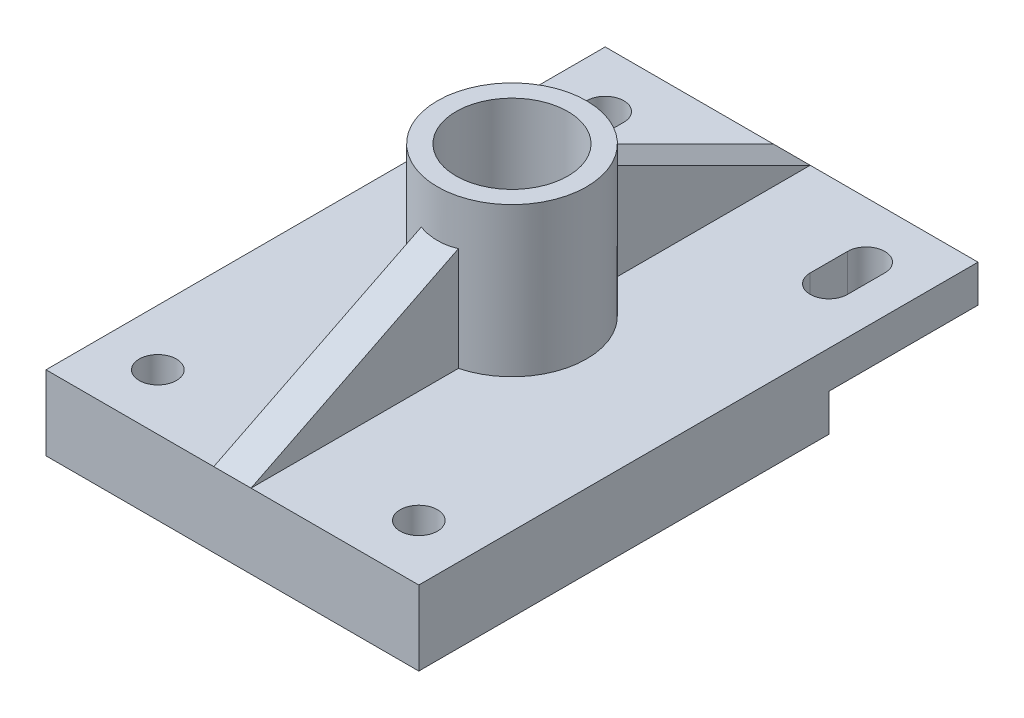
ISO-10303-21;
HEADER;
FILE_DESCRIPTION(('STEP AP214'),'2;1');
FILE_NAME('part.step','',(''),(''),'','','');
FILE_SCHEMA(('AUTOMOTIVE_DESIGN { 1 0 10303 214 1 1 1 1 }'));
ENDSEC;
DATA;
#1=APPLICATION_CONTEXT('core data for automotive mechanical design processes');
#2=APPLICATION_PROTOCOL_DEFINITION('international standard','automotive_design',2000,#1);
#3=PRODUCT_CONTEXT('',#1,'mechanical');
#4=PRODUCT('Part','Part','',(#3));
#5=PRODUCT_RELATED_PRODUCT_CATEGORY('part','',(#4));
#6=PRODUCT_DEFINITION_FORMATION('','',#4);
#7=PRODUCT_DEFINITION_CONTEXT('part definition',#1,'design');
#8=PRODUCT_DEFINITION('design','',#6,#7);
#9=PRODUCT_DEFINITION_SHAPE('','',#8);
#10=(LENGTH_UNIT() NAMED_UNIT(*) SI_UNIT(.MILLI.,.METRE.));
#11=(NAMED_UNIT(*) PLANE_ANGLE_UNIT() SI_UNIT($,.RADIAN.));
#12=(NAMED_UNIT(*) SI_UNIT($,.STERADIAN.) SOLID_ANGLE_UNIT());
#13=UNCERTAINTY_MEASURE_WITH_UNIT(LENGTH_MEASURE(1.E-05),#10,'distance_accuracy_value','');
#14=(GEOMETRIC_REPRESENTATION_CONTEXT(3) GLOBAL_UNCERTAINTY_ASSIGNED_CONTEXT((#13)) GLOBAL_UNIT_ASSIGNED_CONTEXT((#10,
#11,#12)) REPRESENTATION_CONTEXT('',''));
#15=CARTESIAN_POINT('',(0.,0.,0.));
#16=DIRECTION('',(0.,0.,1.));
#17=DIRECTION('',(1.,0.,0.));
#18=AXIS2_PLACEMENT_3D('',#15,#16,#17);
#19=CARTESIAN_POINT('',(0.,0.,0.));
#20=DIRECTION('',(0.,-1.,0.));
#21=DIRECTION('',(0.,0.,-1.));
#22=AXIS2_PLACEMENT_3D('',#19,#20,#21);
#23=PLANE('',#22);
#24=CARTESIAN_POINT('',(35.,0.,60.));
#25=DIRECTION('',(0.,-1.,0.));
#26=DIRECTION('',(0.,0.,1.));
#27=AXIS2_PLACEMENT_3D('',#24,#25,#26);
#28=CIRCLE('',#27,5.);
#29=CARTESIAN_POINT('',(35.,0.,65.));
#30=VERTEX_POINT('',#29);
#31=EDGE_CURVE('E234',#30,#30,#28,.T.);
#32=ORIENTED_EDGE('',*,*,#31,.T.);
#33=EDGE_LOOP('',(#32));
#34=FACE_BOUND('',#33,.T.);
#35=CARTESIAN_POINT('',(35.,0.,-60.));
#36=DIRECTION('',(0.,-1.,0.));
#37=DIRECTION('',(0.,0.,1.));
#38=AXIS2_PLACEMENT_3D('',#35,#36,#37);
#39=CIRCLE('',#38,5.);
#40=CARTESIAN_POINT('',(30.,0.,-60.));
#41=VERTEX_POINT('',#40);
#42=CARTESIAN_POINT('',(40.,0.,-60.));
#43=VERTEX_POINT('',#42);
#44=EDGE_CURVE('E235',#41,#43,#39,.T.);
#45=ORIENTED_EDGE('',*,*,#44,.T.);
#46=DIRECTION('',(0.,0.,1.));
#47=VECTOR('',#46,1.);
#48=CARTESIAN_POINT('',(40.,0.,-60.));
#49=LINE('',#48,#47);
#50=CARTESIAN_POINT('',(40.,0.,-50.));
#51=VERTEX_POINT('',#50);
#52=EDGE_CURVE('E245',#43,#51,#49,.T.);
#53=ORIENTED_EDGE('',*,*,#52,.T.);
#54=CARTESIAN_POINT('',(35.,0.,-50.));
#55=DIRECTION('',(0.,-1.,0.));
#56=DIRECTION('',(0.,0.,1.));
#57=AXIS2_PLACEMENT_3D('',#54,#55,#56);
#58=CIRCLE('',#57,5.);
#59=CARTESIAN_POINT('',(30.,0.,-50.));
#60=VERTEX_POINT('',#59);
#61=EDGE_CURVE('E242',#51,#60,#58,.T.);
#62=ORIENTED_EDGE('',*,*,#61,.T.);
#63=DIRECTION('',(0.,0.,-1.));
#64=VECTOR('',#63,1.);
#65=CARTESIAN_POINT('',(30.,0.,-60.));
#66=LINE('',#65,#64);
#67=EDGE_CURVE('E238',#60,#41,#66,.T.);
#68=ORIENTED_EDGE('',*,*,#67,.T.);
#69=EDGE_LOOP('',(#45,#53,#62,#68));
#70=FACE_BOUND('',#69,.T.);
#71=DIRECTION('',(0.,0.,1.));
#72=VECTOR('',#71,1.);
#73=CARTESIAN_POINT('',(5.,0.,-75.));
#74=LINE('',#73,#72);
#75=CARTESIAN_POINT('',(5.,0.,-75.));
#76=VERTEX_POINT('',#75);
#77=CARTESIAN_POINT('',(5.,0.,-19.3649167310371));
#78=VERTEX_POINT('',#77);
#79=EDGE_CURVE('E202',#76,#78,#74,.T.);
#80=ORIENTED_EDGE('',*,*,#79,.T.);
#81=CARTESIAN_POINT('',(0.,0.,0.));
#82=DIRECTION('',(0.,-1.,0.));
#83=DIRECTION('',(0.,0.,-1.));
#84=AXIS2_PLACEMENT_3D('',#81,#82,#83);
#85=CIRCLE('',#84,20.);
#86=CARTESIAN_POINT('',(5.,0.,19.3649167310371));
#87=VERTEX_POINT('',#86);
#88=EDGE_CURVE('E349',#87,#78,#85,.F.);
#89=ORIENTED_EDGE('',*,*,#88,.F.);
#90=DIRECTION('',(0.,0.,-1.));
#91=VECTOR('',#90,1.);
#92=CARTESIAN_POINT('',(5.,0.,75.));
#93=LINE('',#92,#91);
#94=CARTESIAN_POINT('',(5.,0.,75.));
#95=VERTEX_POINT('',#94);
#96=EDGE_CURVE('E214',#95,#87,#93,.T.);
#97=ORIENTED_EDGE('',*,*,#96,.F.);
#98=DIRECTION('',(1.,0.,0.));
#99=VECTOR('',#98,1.);
#100=CARTESIAN_POINT('',(-50.,0.,75.));
#101=LINE('',#100,#99);
#102=CARTESIAN_POINT('',(50.,0.,75.));
#103=VERTEX_POINT('',#102);
#104=EDGE_CURVE('E318',#95,#103,#101,.T.);
#105=ORIENTED_EDGE('',*,*,#104,.T.);
#106=DIRECTION('',(0.,0.,-1.));
#107=VECTOR('',#106,1.);
#108=CARTESIAN_POINT('',(50.,0.,75.));
#109=LINE('',#108,#107);
#110=CARTESIAN_POINT('',(50.,0.,-75.));
#111=VERTEX_POINT('',#110);
#112=EDGE_CURVE('E183',#103,#111,#109,.T.);
#113=ORIENTED_EDGE('',*,*,#112,.T.);
#114=DIRECTION('',(-1.,0.,0.));
#115=VECTOR('',#114,1.);
#116=CARTESIAN_POINT('',(-50.,0.,-75.));
#117=LINE('',#116,#115);
#118=EDGE_CURVE('E182',#111,#76,#117,.T.);
#119=ORIENTED_EDGE('',*,*,#118,.T.);
#120=EDGE_LOOP('',(#80,#89,#97,#105,#113,#119));
#121=FACE_BOUND('',#120,.T.);
#122=ADVANCED_FACE('F35',(#34,#70,#121),#23,.F.);
#123=CARTESIAN_POINT('',(0.,40.,0.));
#124=DIRECTION('',(0.,-1.,0.));
#125=DIRECTION('',(0.,0.,-1.));
#126=AXIS2_PLACEMENT_3D('',#123,#124,#125);
#127=CYLINDRICAL_SURFACE('',#126,20.);
#128=CARTESIAN_POINT('',(0.,40.,0.));
#129=DIRECTION('',(0.,1.,0.));
#130=DIRECTION('',(0.,0.,1.));
#131=AXIS2_PLACEMENT_3D('',#128,#129,#130);
#132=CIRCLE('',#131,20.);
#133=CARTESIAN_POINT('',(0.,40.,20.));
#134=VERTEX_POINT('',#133);
#135=EDGE_CURVE('E229',#134,#134,#132,.T.);
#136=ORIENTED_EDGE('',*,*,#135,.F.);
#137=EDGE_LOOP('',(#136));
#138=FACE_BOUND('',#137,.T.);
#139=DIRECTION('',(0.,-1.,0.));
#140=VECTOR('',#139,1.);
#141=CARTESIAN_POINT('',(5.,40.,-19.3649167310371));
#142=LINE('',#141,#140);
#143=CARTESIAN_POINT('',(5.,27.8175416344814,-19.3649167310371));
#144=VERTEX_POINT('',#143);
#145=EDGE_CURVE('E11',#144,#78,#142,.T.);
#146=ORIENTED_EDGE('',*,*,#145,.F.);
#147=CARTESIAN_POINT('',(0.,37.5,0.));
#148=DIRECTION('',(0.,-0.894427190999916,0.447213595499958));
#149=DIRECTION('',(0.,-0.447213595499958,-0.894427190999916));
#150=AXIS2_PLACEMENT_3D('',#147,#148,#149);
#151=ELLIPSE('',#150,22.3606797749979,20.);
#152=CARTESIAN_POINT('',(-5.,27.8175416344815,-19.3649167310371));
#153=VERTEX_POINT('',#152);
#154=EDGE_CURVE('E52',#153,#144,#151,.T.);
#155=ORIENTED_EDGE('',*,*,#154,.F.);
#156=DIRECTION('',(0.,-1.,0.));
#157=VECTOR('',#156,1.);
#158=CARTESIAN_POINT('',(-5.,40.,-19.3649167310371));
#159=LINE('',#158,#157);
#160=CARTESIAN_POINT('',(-5.,0.,-19.3649167310371));
#161=VERTEX_POINT('',#160);
#162=EDGE_CURVE('E43',#153,#161,#159,.T.);
#163=ORIENTED_EDGE('',*,*,#162,.T.);
#164=CARTESIAN_POINT('',(-5.,0.,19.3649167310371));
#165=VERTEX_POINT('',#164);
#166=EDGE_CURVE('E190',#161,#165,#85,.F.);
#167=ORIENTED_EDGE('',*,*,#166,.T.);
#168=DIRECTION('',(0.,-1.,0.));
#169=VECTOR('',#168,1.);
#170=CARTESIAN_POINT('',(-5.,40.,19.3649167310371));
#171=LINE('',#170,#169);
#172=CARTESIAN_POINT('',(-5.,27.8175416344815,19.3649167310371));
#173=VERTEX_POINT('',#172);
#174=EDGE_CURVE('E351',#165,#173,#171,.F.);
#175=ORIENTED_EDGE('',*,*,#174,.T.);
#176=CARTESIAN_POINT('',(0.,37.5,0.));
#177=DIRECTION('',(0.,0.894427190999916,0.447213595499958));
#178=DIRECTION('',(0.,-0.447213595499958,0.894427190999916));
#179=AXIS2_PLACEMENT_3D('',#176,#177,#178);
#180=ELLIPSE('',#179,22.3606797749979,20.);
#181=CARTESIAN_POINT('',(5.,27.8175416344815,19.3649167310371));
#182=VERTEX_POINT('',#181);
#183=EDGE_CURVE('E222',#173,#182,#180,.T.);
#184=ORIENTED_EDGE('',*,*,#183,.T.);
#185=DIRECTION('',(0.,-1.,0.));
#186=VECTOR('',#185,1.);
#187=CARTESIAN_POINT('',(5.,40.,19.3649167310371));
#188=LINE('',#187,#186);
#189=EDGE_CURVE('E354',#87,#182,#188,.F.);
#190=ORIENTED_EDGE('',*,*,#189,.F.);
#191=ORIENTED_EDGE('',*,*,#88,.T.);
#192=EDGE_LOOP('',(#146,#155,#163,#167,#175,#184,#190,#191));
#193=FACE_BOUND('',#192,.T.);
#194=ADVANCED_FACE('F355',(#138,#193),#127,.T.);
#195=CARTESIAN_POINT('',(-35.,0.,60.));
#196=DIRECTION('',(0.,1.,0.));
#197=DIRECTION('',(0.,0.,1.));
#198=AXIS2_PLACEMENT_3D('',#195,#196,#197);
#199=CIRCLE('',#198,5.);
#200=CARTESIAN_POINT('',(-35.,0.,65.));
#201=VERTEX_POINT('',#200);
#202=EDGE_CURVE('E251',#201,#201,#199,.T.);
#203=ORIENTED_EDGE('',*,*,#202,.F.);
#204=EDGE_LOOP('',(#203));
#205=FACE_BOUND('',#204,.T.);
#206=DIRECTION('',(0.,0.,1.));
#207=VECTOR('',#206,1.);
#208=CARTESIAN_POINT('',(-40.,0.,-60.));
#209=LINE('',#208,#207);
#210=CARTESIAN_POINT('',(-40.,0.,-60.));
#211=VERTEX_POINT('',#210);
#212=CARTESIAN_POINT('',(-40.,0.,-50.));
#213=VERTEX_POINT('',#212);
#214=EDGE_CURVE('E264',#211,#213,#209,.T.);
#215=ORIENTED_EDGE('',*,*,#214,.F.);
#216=CARTESIAN_POINT('',(-35.,0.,-60.));
#217=DIRECTION('',(0.,1.,0.));
#218=DIRECTION('',(0.,0.,1.));
#219=AXIS2_PLACEMENT_3D('',#216,#217,#218);
#220=CIRCLE('',#219,5.);
#221=CARTESIAN_POINT('',(-30.,0.,-60.));
#222=VERTEX_POINT('',#221);
#223=EDGE_CURVE('E262',#222,#211,#220,.T.);
#224=ORIENTED_EDGE('',*,*,#223,.F.);
#225=DIRECTION('',(0.,0.,-1.));
#226=VECTOR('',#225,1.);
#227=CARTESIAN_POINT('',(-30.,0.,-60.));
#228=LINE('',#227,#226);
#229=CARTESIAN_POINT('',(-30.,0.,-50.));
#230=VERTEX_POINT('',#229);
#231=EDGE_CURVE('E271',#230,#222,#228,.T.);
#232=ORIENTED_EDGE('',*,*,#231,.F.);
#233=CARTESIAN_POINT('',(-35.,0.,-50.));
#234=DIRECTION('',(0.,1.,0.));
#235=DIRECTION('',(0.,0.,1.));
#236=AXIS2_PLACEMENT_3D('',#233,#234,#235);
#237=CIRCLE('',#236,5.);
#238=EDGE_CURVE('E268',#213,#230,#237,.T.);
#239=ORIENTED_EDGE('',*,*,#238,.F.);
#240=EDGE_LOOP('',(#215,#224,#232,#239));
#241=FACE_BOUND('',#240,.T.);
#242=ORIENTED_EDGE('',*,*,#166,.F.);
#243=DIRECTION('',(0.,0.,1.));
#244=VECTOR('',#243,1.);
#245=CARTESIAN_POINT('',(-5.,0.,-75.));
#246=LINE('',#245,#244);
#247=CARTESIAN_POINT('',(-5.,0.,-75.));
#248=VERTEX_POINT('',#247);
#249=EDGE_CURVE('E187',#248,#161,#246,.T.);
#250=ORIENTED_EDGE('',*,*,#249,.F.);
#251=CARTESIAN_POINT('',(-50.,0.,-75.));
#252=VERTEX_POINT('',#251);
#253=EDGE_CURVE('E168',#248,#252,#117,.T.);
#254=ORIENTED_EDGE('',*,*,#253,.T.);
#255=DIRECTION('',(0.,0.,1.));
#256=VECTOR('',#255,1.);
#257=CARTESIAN_POINT('',(-50.,0.,75.));
#258=LINE('',#257,#256);
#259=CARTESIAN_POINT('',(-50.,0.,75.));
#260=VERTEX_POINT('',#259);
#261=EDGE_CURVE('E316',#252,#260,#258,.T.);
#262=ORIENTED_EDGE('',*,*,#261,.T.);
#263=CARTESIAN_POINT('',(-5.,0.,75.));
#264=VERTEX_POINT('',#263);
#265=EDGE_CURVE('E308',#260,#264,#101,.T.);
#266=ORIENTED_EDGE('',*,*,#265,.T.);
#267=DIRECTION('',(0.,0.,-1.));
#268=VECTOR('',#267,1.);
#269=CARTESIAN_POINT('',(-5.,0.,75.));
#270=LINE('',#269,#268);
#271=EDGE_CURVE('E215',#264,#165,#270,.T.);
#272=ORIENTED_EDGE('',*,*,#271,.T.);
#273=EDGE_LOOP('',(#242,#250,#254,#262,#266,#272));
#274=FACE_BOUND('',#273,.T.);
#275=ADVANCED_FACE('F188',(#205,#241,#274),#23,.F.);
#276=CARTESIAN_POINT('',(-50.,-10.,-35.));
#277=DIRECTION('',(0.,-1.,0.));
#278=DIRECTION('',(0.,0.,-1.));
#279=AXIS2_PLACEMENT_3D('',#276,#277,#278);
#280=PLANE('',#279);
#281=CARTESIAN_POINT('',(-35.,-10.,-60.));
#282=DIRECTION('',(0.,-1.,0.));
#283=DIRECTION('',(0.,0.,-1.));
#284=AXIS2_PLACEMENT_3D('',#281,#282,#283);
#285=CIRCLE('',#284,5.);
#286=CARTESIAN_POINT('',(-40.,-10.,-60.));
#287=VERTEX_POINT('',#286);
#288=CARTESIAN_POINT('',(-30.,-10.,-60.));
#289=VERTEX_POINT('',#288);
#290=EDGE_CURVE('E335',#287,#289,#285,.T.);
#291=ORIENTED_EDGE('',*,*,#290,.F.);
#292=DIRECTION('',(0.,0.,-1.));
#293=VECTOR('',#292,1.);
#294=CARTESIAN_POINT('',(-40.,-10.,-35.));
#295=LINE('',#294,#293);
#296=CARTESIAN_POINT('',(-40.,-10.,-50.));
#297=VERTEX_POINT('',#296);
#298=EDGE_CURVE('E324',#297,#287,#295,.T.);
#299=ORIENTED_EDGE('',*,*,#298,.F.);
#300=CARTESIAN_POINT('',(-35.,-10.,-50.));
#301=DIRECTION('',(0.,-1.,0.));
#302=DIRECTION('',(0.,0.,-1.));
#303=AXIS2_PLACEMENT_3D('',#300,#301,#302);
#304=CIRCLE('',#303,5.);
#305=CARTESIAN_POINT('',(-30.,-10.,-50.));
#306=VERTEX_POINT('',#305);
#307=EDGE_CURVE('E330',#306,#297,#304,.T.);
#308=ORIENTED_EDGE('',*,*,#307,.F.);
#309=DIRECTION('',(0.,0.,1.));
#310=VECTOR('',#309,1.);
#311=CARTESIAN_POINT('',(-30.,-10.,-35.));
#312=LINE('',#311,#310);
#313=EDGE_CURVE('E333',#289,#306,#312,.T.);
#314=ORIENTED_EDGE('',*,*,#313,.F.);
#315=EDGE_LOOP('',(#291,#299,#308,#314));
#316=FACE_BOUND('',#315,.T.);
#317=DIRECTION('',(0.,0.,-1.));
#318=VECTOR('',#317,1.);
#319=CARTESIAN_POINT('',(50.,-10.,-35.));
#320=LINE('',#319,#318);
#321=CARTESIAN_POINT('',(50.,-10.,-35.));
#322=VERTEX_POINT('',#321);
#323=CARTESIAN_POINT('',(50.,-10.,-75.));
#324=VERTEX_POINT('',#323);
#325=EDGE_CURVE('E277',#322,#324,#320,.T.);
#326=ORIENTED_EDGE('',*,*,#325,.F.);
#327=DIRECTION('',(1.,0.,0.));
#328=VECTOR('',#327,1.);
#329=CARTESIAN_POINT('',(-50.,-10.,-35.));
#330=LINE('',#329,#328);
#331=CARTESIAN_POINT('',(-50.,-10.,-35.));
#332=VERTEX_POINT('',#331);
#333=EDGE_CURVE('E301',#332,#322,#330,.T.);
#334=ORIENTED_EDGE('',*,*,#333,.F.);
#335=DIRECTION('',(0.,0.,-1.));
#336=VECTOR('',#335,1.);
#337=CARTESIAN_POINT('',(-50.,-10.,-35.));
#338=LINE('',#337,#336);
#339=CARTESIAN_POINT('',(-50.,-10.,-75.));
#340=VERTEX_POINT('',#339);
#341=EDGE_CURVE('E288',#332,#340,#338,.T.);
#342=ORIENTED_EDGE('',*,*,#341,.T.);
#343=DIRECTION('',(1.,0.,0.));
#344=VECTOR('',#343,1.);
#345=CARTESIAN_POINT('',(-50.,-10.,-75.));
#346=LINE('',#345,#344);
#347=EDGE_CURVE('E293',#340,#324,#346,.T.);
#348=ORIENTED_EDGE('',*,*,#347,.T.);
#349=EDGE_LOOP('',(#326,#334,#342,#348));
#350=FACE_BOUND('',#349,.T.);
#351=DIRECTION('',(0.,0.,-1.));
#352=VECTOR('',#351,1.);
#353=CARTESIAN_POINT('',(40.,-10.,-35.));
#354=LINE('',#353,#352);
#355=CARTESIAN_POINT('',(40.,-10.,-50.));
#356=VERTEX_POINT('',#355);
#357=CARTESIAN_POINT('',(40.,-10.,-60.));
#358=VERTEX_POINT('',#357);
#359=EDGE_CURVE('E343',#356,#358,#354,.T.);
#360=ORIENTED_EDGE('',*,*,#359,.T.);
#361=CARTESIAN_POINT('',(35.,-10.,-60.));
#362=DIRECTION('',(0.,-1.,0.));
#363=DIRECTION('',(0.,0.,-1.));
#364=AXIS2_PLACEMENT_3D('',#361,#362,#363);
#365=CIRCLE('',#364,5.);
#366=CARTESIAN_POINT('',(30.,-10.,-60.));
#367=VERTEX_POINT('',#366);
#368=EDGE_CURVE('E346',#358,#367,#365,.F.);
#369=ORIENTED_EDGE('',*,*,#368,.T.);
#370=DIRECTION('',(0.,0.,1.));
#371=VECTOR('',#370,1.);
#372=CARTESIAN_POINT('',(30.,-10.,-34.9999999999999));
#373=LINE('',#372,#371);
#374=CARTESIAN_POINT('',(30.,-10.,-50.));
#375=VERTEX_POINT('',#374);
#376=EDGE_CURVE('E337',#367,#375,#373,.T.);
#377=ORIENTED_EDGE('',*,*,#376,.T.);
#378=CARTESIAN_POINT('',(35.,-10.,-50.));
#379=DIRECTION('',(0.,-1.,0.));
#380=DIRECTION('',(0.,0.,-1.));
#381=AXIS2_PLACEMENT_3D('',#378,#379,#380);
#382=CIRCLE('',#381,5.);
#383=EDGE_CURVE('E340',#375,#356,#382,.F.);
#384=ORIENTED_EDGE('',*,*,#383,.T.);
#385=EDGE_LOOP('',(#360,#369,#377,#384));
#386=FACE_BOUND('',#385,.T.);
#387=ADVANCED_FACE('F402',(#316,#350,#386),#280,.T.);
#388=CARTESIAN_POINT('',(50.,-20.,75.));
#389=DIRECTION('',(1.,0.,0.));
#390=DIRECTION('',(0.,0.,-1.));
#391=AXIS2_PLACEMENT_3D('',#388,#389,#390);
#392=PLANE('',#391);
#393=DIRECTION('',(0.,0.,-1.));
#394=VECTOR('',#393,1.);
#395=CARTESIAN_POINT('',(50.,-20.,75.));
#396=LINE('',#395,#394);
#397=CARTESIAN_POINT('',(50.,-20.,75.));
#398=VERTEX_POINT('',#397);
#399=CARTESIAN_POINT('',(50.,-20.,-35.));
#400=VERTEX_POINT('',#399);
#401=EDGE_CURVE('E304',#398,#400,#396,.T.);
#402=ORIENTED_EDGE('',*,*,#401,.T.);
#403=DIRECTION('',(0.,1.,0.));
#404=VECTOR('',#403,1.);
#405=CARTESIAN_POINT('',(50.,-20.,-35.));
#406=LINE('',#405,#404);
#407=EDGE_CURVE('E291',#400,#322,#406,.T.);
#408=ORIENTED_EDGE('',*,*,#407,.T.);
#409=ORIENTED_EDGE('',*,*,#325,.T.);
#410=DIRECTION('',(0.,1.,0.));
#411=VECTOR('',#410,1.);
#412=CARTESIAN_POINT('',(50.,-20.,-75.));
#413=LINE('',#412,#411);
#414=EDGE_CURVE('E313',#324,#111,#413,.T.);
#415=ORIENTED_EDGE('',*,*,#414,.T.);
#416=ORIENTED_EDGE('',*,*,#112,.F.);
#417=DIRECTION('',(0.,1.,0.));
#418=VECTOR('',#417,1.);
#419=CARTESIAN_POINT('',(50.,-20.,75.));
#420=LINE('',#419,#418);
#421=EDGE_CURVE('E321',#398,#103,#420,.T.);
#422=ORIENTED_EDGE('',*,*,#421,.F.);
#423=EDGE_LOOP('',(#402,#408,#409,#415,#416,#422));
#424=FACE_BOUND('',#423,.T.);
#425=ADVANCED_FACE('F37',(#424),#392,.T.);
#426=CARTESIAN_POINT('',(-50.,-20.,75.));
#427=DIRECTION('',(-1.,0.,0.));
#428=DIRECTION('',(0.,0.,1.));
#429=AXIS2_PLACEMENT_3D('',#426,#427,#428);
#430=PLANE('',#429);
#431=ORIENTED_EDGE('',*,*,#341,.F.);
#432=DIRECTION('',(0.,1.,0.));
#433=VECTOR('',#432,1.);
#434=CARTESIAN_POINT('',(-50.,-20.,-35.));
#435=LINE('',#434,#433);
#436=CARTESIAN_POINT('',(-50.,-20.,-35.));
#437=VERTEX_POINT('',#436);
#438=EDGE_CURVE('E290',#437,#332,#435,.T.);
#439=ORIENTED_EDGE('',*,*,#438,.F.);
#440=DIRECTION('',(0.,0.,1.));
#441=VECTOR('',#440,1.);
#442=CARTESIAN_POINT('',(-50.,-20.,75.));
#443=LINE('',#442,#441);
#444=CARTESIAN_POINT('',(-50.,-20.,75.));
#445=VERTEX_POINT('',#444);
#446=EDGE_CURVE('E307',#437,#445,#443,.T.);
#447=ORIENTED_EDGE('',*,*,#446,.T.);
#448=DIRECTION('',(0.,1.,0.));
#449=VECTOR('',#448,1.);
#450=CARTESIAN_POINT('',(-50.,-20.,75.));
#451=LINE('',#450,#449);
#452=EDGE_CURVE('E325',#445,#260,#451,.T.);
#453=ORIENTED_EDGE('',*,*,#452,.T.);
#454=ORIENTED_EDGE('',*,*,#261,.F.);
#455=DIRECTION('',(0.,1.,0.));
#456=VECTOR('',#455,1.);
#457=CARTESIAN_POINT('',(-50.,-20.,-75.));
#458=LINE('',#457,#456);
#459=EDGE_CURVE('E178',#340,#252,#458,.T.);
#460=ORIENTED_EDGE('',*,*,#459,.F.);
#461=EDGE_LOOP('',(#431,#439,#447,#453,#454,#460));
#462=FACE_BOUND('',#461,.T.);
#463=ADVANCED_FACE('F458',(#462),#430,.T.);
#464=CARTESIAN_POINT('',(-50.,-20.,-75.));
#465=DIRECTION('',(0.,0.,-1.));
#466=DIRECTION('',(-1.,0.,0.));
#467=AXIS2_PLACEMENT_3D('',#464,#465,#466);
#468=PLANE('',#467);
#469=ORIENTED_EDGE('',*,*,#414,.F.);
#470=ORIENTED_EDGE('',*,*,#347,.F.);
#471=ORIENTED_EDGE('',*,*,#459,.T.);
#472=ORIENTED_EDGE('',*,*,#253,.F.);
#473=DIRECTION('',(-1.,0.,0.));
#474=VECTOR('',#473,1.);
#475=CARTESIAN_POINT('',(5.,0.,-75.));
#476=LINE('',#475,#474);
#477=EDGE_CURVE('E174',#76,#248,#476,.T.);
#478=ORIENTED_EDGE('',*,*,#477,.F.);
#479=ORIENTED_EDGE('',*,*,#118,.F.);
#480=EDGE_LOOP('',(#469,#470,#471,#472,#478,#479));
#481=FACE_BOUND('',#480,.T.);
#482=ADVANCED_FACE('F171',(#481),#468,.T.);
#483=CARTESIAN_POINT('',(0.,-20.,0.));
#484=DIRECTION('',(0.,-1.,0.));
#485=DIRECTION('',(0.,0.,-1.));
#486=AXIS2_PLACEMENT_3D('',#483,#484,#485);
#487=PLANE('',#486);
#488=CARTESIAN_POINT('',(35.,-20.,60.));
#489=DIRECTION('',(0.,-1.,0.));
#490=DIRECTION('',(0.,0.,1.));
#491=AXIS2_PLACEMENT_3D('',#488,#489,#490);
#492=CIRCLE('',#491,5.);
#493=CARTESIAN_POINT('',(35.,-20.,65.));
#494=VERTEX_POINT('',#493);
#495=EDGE_CURVE('E239',#494,#494,#492,.T.);
#496=ORIENTED_EDGE('',*,*,#495,.F.);
#497=EDGE_LOOP('',(#496));
#498=FACE_BOUND('',#497,.T.);
#499=CARTESIAN_POINT('',(-35.,-20.,60.));
#500=DIRECTION('',(0.,1.,0.));
#501=DIRECTION('',(0.,0.,1.));
#502=AXIS2_PLACEMENT_3D('',#499,#500,#501);
#503=CIRCLE('',#502,5.);
#504=CARTESIAN_POINT('',(-35.,-20.,65.));
#505=VERTEX_POINT('',#504);
#506=EDGE_CURVE('E265',#505,#505,#503,.T.);
#507=ORIENTED_EDGE('',*,*,#506,.T.);
#508=EDGE_LOOP('',(#507));
#509=FACE_BOUND('',#508,.T.);
#510=ORIENTED_EDGE('',*,*,#446,.F.);
#511=DIRECTION('',(1.,0.,0.));
#512=VECTOR('',#511,1.);
#513=CARTESIAN_POINT('',(-50.,-20.,-35.));
#514=LINE('',#513,#512);
#515=EDGE_CURVE('E298',#437,#400,#514,.T.);
#516=ORIENTED_EDGE('',*,*,#515,.T.);
#517=ORIENTED_EDGE('',*,*,#401,.F.);
#518=DIRECTION('',(1.,0.,0.));
#519=VECTOR('',#518,1.);
#520=CARTESIAN_POINT('',(-50.,-20.,75.));
#521=LINE('',#520,#519);
#522=EDGE_CURVE('E310',#445,#398,#521,.T.);
#523=ORIENTED_EDGE('',*,*,#522,.F.);
#524=EDGE_LOOP('',(#510,#516,#517,#523));
#525=FACE_BOUND('',#524,.T.);
#526=ADVANCED_FACE('F451',(#498,#509,#525),#487,.T.);
#527=CARTESIAN_POINT('',(-50.,-20.,75.));
#528=DIRECTION('',(0.,0.,1.));
#529=DIRECTION('',(1.,0.,0.));
#530=AXIS2_PLACEMENT_3D('',#527,#528,#529);
#531=PLANE('',#530);
#532=ORIENTED_EDGE('',*,*,#265,.F.);
#533=ORIENTED_EDGE('',*,*,#452,.F.);
#534=ORIENTED_EDGE('',*,*,#522,.T.);
#535=ORIENTED_EDGE('',*,*,#421,.T.);
#536=ORIENTED_EDGE('',*,*,#104,.F.);
#537=DIRECTION('',(-1.,0.,0.));
#538=VECTOR('',#537,1.);
#539=CARTESIAN_POINT('',(5.,0.,75.));
#540=LINE('',#539,#538);
#541=EDGE_CURVE('E217',#95,#264,#540,.T.);
#542=ORIENTED_EDGE('',*,*,#541,.T.);
#543=EDGE_LOOP('',(#532,#533,#534,#535,#536,#542));
#544=FACE_BOUND('',#543,.T.);
#545=ADVANCED_FACE('F364',(#544),#531,.T.);
#546=CARTESIAN_POINT('',(-50.,-20.,-35.));
#547=DIRECTION('',(0.,0.,-1.));
#548=DIRECTION('',(-1.,0.,0.));
#549=AXIS2_PLACEMENT_3D('',#546,#547,#548);
#550=PLANE('',#549);
#551=ORIENTED_EDGE('',*,*,#407,.F.);
#552=ORIENTED_EDGE('',*,*,#515,.F.);
#553=ORIENTED_EDGE('',*,*,#438,.T.);
#554=ORIENTED_EDGE('',*,*,#333,.T.);
#555=EDGE_LOOP('',(#551,#552,#553,#554));
#556=FACE_BOUND('',#555,.T.);
#557=ADVANCED_FACE('F444',(#556),#550,.T.);
#558=CARTESIAN_POINT('',(-35.,-20.,-60.));
#559=DIRECTION('',(0.,1.,0.));
#560=DIRECTION('',(0.,0.,1.));
#561=AXIS2_PLACEMENT_3D('',#558,#559,#560);
#562=CYLINDRICAL_SURFACE('',#561,5.);
#563=ORIENTED_EDGE('',*,*,#290,.T.);
#564=DIRECTION('',(0.,1.,0.));
#565=VECTOR('',#564,1.);
#566=CARTESIAN_POINT('',(-30.,-20.,-60.));
#567=LINE('',#566,#565);
#568=EDGE_CURVE('E275',#289,#222,#567,.T.);
#569=ORIENTED_EDGE('',*,*,#568,.T.);
#570=ORIENTED_EDGE('',*,*,#223,.T.);
#571=DIRECTION('',(0.,1.,0.));
#572=VECTOR('',#571,1.);
#573=CARTESIAN_POINT('',(-40.,-20.,-60.));
#574=LINE('',#573,#572);
#575=EDGE_CURVE('E274',#287,#211,#574,.T.);
#576=ORIENTED_EDGE('',*,*,#575,.F.);
#577=EDGE_LOOP('',(#563,#569,#570,#576));
#578=FACE_BOUND('',#577,.T.);
#579=ADVANCED_FACE('F421',(#578),#562,.F.);
#580=CARTESIAN_POINT('',(-30.,-20.,-60.));
#581=DIRECTION('',(1.,0.,0.));
#582=DIRECTION('',(0.,0.,-1.));
#583=AXIS2_PLACEMENT_3D('',#580,#581,#582);
#584=PLANE('',#583);
#585=ORIENTED_EDGE('',*,*,#313,.T.);
#586=DIRECTION('',(0.,1.,0.));
#587=VECTOR('',#586,1.);
#588=CARTESIAN_POINT('',(-30.,-20.,-50.));
#589=LINE('',#588,#587);
#590=EDGE_CURVE('E278',#306,#230,#589,.T.);
#591=ORIENTED_EDGE('',*,*,#590,.T.);
#592=ORIENTED_EDGE('',*,*,#231,.T.);
#593=ORIENTED_EDGE('',*,*,#568,.F.);
#594=EDGE_LOOP('',(#585,#591,#592,#593));
#595=FACE_BOUND('',#594,.T.);
#596=ADVANCED_FACE('F428',(#595),#584,.F.);
#597=CARTESIAN_POINT('',(-35.,-20.,-50.));
#598=DIRECTION('',(0.,1.,0.));
#599=DIRECTION('',(0.,0.,1.));
#600=AXIS2_PLACEMENT_3D('',#597,#598,#599);
#601=CYLINDRICAL_SURFACE('',#600,5.);
#602=ORIENTED_EDGE('',*,*,#307,.T.);
#603=DIRECTION('',(0.,1.,0.));
#604=VECTOR('',#603,1.);
#605=CARTESIAN_POINT('',(-40.,-20.,-50.));
#606=LINE('',#605,#604);
#607=EDGE_CURVE('E280',#297,#213,#606,.T.);
#608=ORIENTED_EDGE('',*,*,#607,.T.);
#609=ORIENTED_EDGE('',*,*,#238,.T.);
#610=ORIENTED_EDGE('',*,*,#590,.F.);
#611=EDGE_LOOP('',(#602,#608,#609,#610));
#612=FACE_BOUND('',#611,.T.);
#613=ADVANCED_FACE('F430',(#612),#601,.F.);
#614=CARTESIAN_POINT('',(-40.,-20.,-60.));
#615=DIRECTION('',(-1.,0.,0.));
#616=DIRECTION('',(0.,0.,1.));
#617=AXIS2_PLACEMENT_3D('',#614,#615,#616);
#618=PLANE('',#617);
#619=ORIENTED_EDGE('',*,*,#298,.T.);
#620=ORIENTED_EDGE('',*,*,#575,.T.);
#621=ORIENTED_EDGE('',*,*,#214,.T.);
#622=ORIENTED_EDGE('',*,*,#607,.F.);
#623=EDGE_LOOP('',(#619,#620,#621,#622));
#624=FACE_BOUND('',#623,.T.);
#625=ADVANCED_FACE('F416',(#624),#618,.F.);
#626=CARTESIAN_POINT('',(-35.,-20.,60.));
#627=DIRECTION('',(0.,1.,0.));
#628=DIRECTION('',(0.,0.,1.));
#629=AXIS2_PLACEMENT_3D('',#626,#627,#628);
#630=CYLINDRICAL_SURFACE('',#629,5.);
#631=ORIENTED_EDGE('',*,*,#506,.F.);
#632=EDGE_LOOP('',(#631));
#633=FACE_BOUND('',#632,.T.);
#634=ORIENTED_EDGE('',*,*,#202,.T.);
#635=EDGE_LOOP('',(#634));
#636=FACE_BOUND('',#635,.T.);
#637=ADVANCED_FACE('F437',(#633,#636),#630,.F.);
#638=CARTESIAN_POINT('',(35.,-20.,-60.));
#639=DIRECTION('',(0.,1.,0.));
#640=DIRECTION('',(0.,0.,1.));
#641=AXIS2_PLACEMENT_3D('',#638,#639,#640);
#642=CYLINDRICAL_SURFACE('',#641,5.);
#643=DIRECTION('',(0.,1.,0.));
#644=VECTOR('',#643,1.);
#645=CARTESIAN_POINT('',(40.,-20.,-60.));
#646=LINE('',#645,#644);
#647=EDGE_CURVE('E249',#358,#43,#646,.T.);
#648=ORIENTED_EDGE('',*,*,#647,.T.);
#649=ORIENTED_EDGE('',*,*,#44,.F.);
#650=DIRECTION('',(0.,1.,0.));
#651=VECTOR('',#650,1.);
#652=CARTESIAN_POINT('',(30.,-20.,-60.));
#653=LINE('',#652,#651);
#654=EDGE_CURVE('E248',#367,#41,#653,.T.);
#655=ORIENTED_EDGE('',*,*,#654,.F.);
#656=ORIENTED_EDGE('',*,*,#368,.F.);
#657=EDGE_LOOP('',(#648,#649,#655,#656));
#658=FACE_BOUND('',#657,.T.);
#659=ADVANCED_FACE('F447',(#658),#642,.F.);
#660=CARTESIAN_POINT('',(40.,-20.,-60.));
#661=DIRECTION('',(-1.,0.,0.));
#662=DIRECTION('',(0.,0.,1.));
#663=AXIS2_PLACEMENT_3D('',#660,#661,#662);
#664=PLANE('',#663);
#665=DIRECTION('',(0.,1.,0.));
#666=VECTOR('',#665,1.);
#667=CARTESIAN_POINT('',(40.,-20.,-50.));
#668=LINE('',#667,#666);
#669=EDGE_CURVE('E252',#356,#51,#668,.T.);
#670=ORIENTED_EDGE('',*,*,#669,.T.);
#671=ORIENTED_EDGE('',*,*,#52,.F.);
#672=ORIENTED_EDGE('',*,*,#647,.F.);
#673=ORIENTED_EDGE('',*,*,#359,.F.);
#674=EDGE_LOOP('',(#670,#671,#672,#673));
#675=FACE_BOUND('',#674,.T.);
#676=ADVANCED_FACE('F539',(#675),#664,.T.);
#677=CARTESIAN_POINT('',(35.,-20.,-50.));
#678=DIRECTION('',(0.,1.,0.));
#679=DIRECTION('',(0.,0.,1.));
#680=AXIS2_PLACEMENT_3D('',#677,#678,#679);
#681=CYLINDRICAL_SURFACE('',#680,5.);
#682=DIRECTION('',(0.,1.,0.));
#683=VECTOR('',#682,1.);
#684=CARTESIAN_POINT('',(30.,-20.,-50.));
#685=LINE('',#684,#683);
#686=EDGE_CURVE('E254',#375,#60,#685,.T.);
#687=ORIENTED_EDGE('',*,*,#686,.T.);
#688=ORIENTED_EDGE('',*,*,#61,.F.);
#689=ORIENTED_EDGE('',*,*,#669,.F.);
#690=ORIENTED_EDGE('',*,*,#383,.F.);
#691=EDGE_LOOP('',(#687,#688,#689,#690));
#692=FACE_BOUND('',#691,.T.);
#693=ADVANCED_FACE('F542',(#692),#681,.F.);
#694=CARTESIAN_POINT('',(30.,-20.,-60.));
#695=DIRECTION('',(1.,0.,0.));
#696=DIRECTION('',(0.,0.,-1.));
#697=AXIS2_PLACEMENT_3D('',#694,#695,#696);
#698=PLANE('',#697);
#699=ORIENTED_EDGE('',*,*,#654,.T.);
#700=ORIENTED_EDGE('',*,*,#67,.F.);
#701=ORIENTED_EDGE('',*,*,#686,.F.);
#702=ORIENTED_EDGE('',*,*,#376,.F.);
#703=EDGE_LOOP('',(#699,#700,#701,#702));
#704=FACE_BOUND('',#703,.T.);
#705=ADVANCED_FACE('F546',(#704),#698,.T.);
#706=CARTESIAN_POINT('',(35.,-20.,60.));
#707=DIRECTION('',(0.,1.,0.));
#708=DIRECTION('',(0.,0.,1.));
#709=AXIS2_PLACEMENT_3D('',#706,#707,#708);
#710=CYLINDRICAL_SURFACE('',#709,5.);
#711=ORIENTED_EDGE('',*,*,#495,.T.);
#712=EDGE_LOOP('',(#711));
#713=FACE_BOUND('',#712,.T.);
#714=ORIENTED_EDGE('',*,*,#31,.F.);
#715=EDGE_LOOP('',(#714));
#716=FACE_BOUND('',#715,.T.);
#717=ADVANCED_FACE('F536',(#713,#716),#710,.F.);
#718=CARTESIAN_POINT('',(0.,40.,0.));
#719=DIRECTION('',(0.,1.,0.));
#720=DIRECTION('',(0.,0.,1.));
#721=AXIS2_PLACEMENT_3D('',#718,#719,#720);
#722=PLANE('',#721);
#723=ORIENTED_EDGE('',*,*,#135,.T.);
#724=EDGE_LOOP('',(#723));
#725=FACE_BOUND('',#724,.T.);
#726=CARTESIAN_POINT('',(0.,40.,0.));
#727=DIRECTION('',(0.,1.,0.));
#728=DIRECTION('',(0.,0.,1.));
#729=AXIS2_PLACEMENT_3D('',#726,#727,#728);
#730=CIRCLE('',#729,15.);
#731=CARTESIAN_POINT('',(0.,40.,15.));
#732=VERTEX_POINT('',#731);
#733=EDGE_CURVE('E226',#732,#732,#730,.T.);
#734=ORIENTED_EDGE('',*,*,#733,.F.);
#735=EDGE_LOOP('',(#734));
#736=FACE_BOUND('',#735,.T.);
#737=ADVANCED_FACE('F498',(#725,#736),#722,.T.);
#738=CARTESIAN_POINT('',(0.,40.,0.));
#739=DIRECTION('',(0.,-1.,0.));
#740=DIRECTION('',(0.,0.,-1.));
#741=AXIS2_PLACEMENT_3D('',#738,#739,#740);
#742=CYLINDRICAL_SURFACE('',#741,15.);
#743=CARTESIAN_POINT('',(0.,0.,0.));
#744=DIRECTION('',(0.,1.,0.));
#745=DIRECTION('',(0.,0.,1.));
#746=AXIS2_PLACEMENT_3D('',#743,#744,#745);
#747=CIRCLE('',#746,15.);
#748=CARTESIAN_POINT('',(0.,0.,15.));
#749=VERTEX_POINT('',#748);
#750=EDGE_CURVE('E225',#749,#749,#747,.T.);
#751=ORIENTED_EDGE('',*,*,#750,.F.);
#752=EDGE_LOOP('',(#751));
#753=FACE_BOUND('',#752,.T.);
#754=ORIENTED_EDGE('',*,*,#733,.T.);
#755=EDGE_LOOP('',(#754));
#756=FACE_BOUND('',#755,.T.);
#757=ADVANCED_FACE('F399',(#753,#756),#742,.F.);
#758=ORIENTED_EDGE('',*,*,#750,.T.);
#759=EDGE_LOOP('',(#758));
#760=FACE_BOUND('',#759,.T.);
#761=ADVANCED_FACE('F389',(#760),#23,.F.);
#762=CARTESIAN_POINT('',(5.,0.,0.));
#763=DIRECTION('',(-1.,0.,0.));
#764=DIRECTION('',(0.,0.,1.));
#765=AXIS2_PLACEMENT_3D('',#762,#763,#764);
#766=PLANE('',#765);
#767=ORIENTED_EDGE('',*,*,#96,.T.);
#768=ORIENTED_EDGE('',*,*,#189,.T.);
#769=DIRECTION('',(0.,0.447213595499958,-0.894427190999916));
#770=VECTOR('',#769,1.);
#771=CARTESIAN_POINT('',(5.,0.,75.));
#772=LINE('',#771,#770);
#773=EDGE_CURVE('E211',#95,#182,#772,.T.);
#774=ORIENTED_EDGE('',*,*,#773,.F.);
#775=EDGE_LOOP('',(#767,#768,#774));
#776=FACE_BOUND('',#775,.T.);
#777=ADVANCED_FACE('F372',(#776),#766,.F.);
#778=CARTESIAN_POINT('',(-5.,0.,0.));
#779=DIRECTION('',(-1.,0.,0.));
#780=DIRECTION('',(0.,0.,1.));
#781=AXIS2_PLACEMENT_3D('',#778,#779,#780);
#782=PLANE('',#781);
#783=ORIENTED_EDGE('',*,*,#174,.F.);
#784=ORIENTED_EDGE('',*,*,#271,.F.);
#785=DIRECTION('',(0.,0.447213595499958,-0.894427190999916));
#786=VECTOR('',#785,1.);
#787=CARTESIAN_POINT('',(-5.,0.,75.));
#788=LINE('',#787,#786);
#789=EDGE_CURVE('E210',#264,#173,#788,.T.);
#790=ORIENTED_EDGE('',*,*,#789,.T.);
#791=EDGE_LOOP('',(#783,#784,#790));
#792=FACE_BOUND('',#791,.T.);
#793=ADVANCED_FACE('F358',(#792),#782,.T.);
#794=CARTESIAN_POINT('',(5.,0.,75.));
#795=DIRECTION('',(0.,0.894427190999916,0.447213595499958));
#796=DIRECTION('',(0.,-0.447213595499958,0.894427190999916));
#797=AXIS2_PLACEMENT_3D('',#794,#795,#796);
#798=PLANE('',#797);
#799=ORIENTED_EDGE('',*,*,#183,.F.);
#800=ORIENTED_EDGE('',*,*,#789,.F.);
#801=ORIENTED_EDGE('',*,*,#541,.F.);
#802=ORIENTED_EDGE('',*,*,#773,.T.);
#803=EDGE_LOOP('',(#799,#800,#801,#802));
#804=FACE_BOUND('',#803,.T.);
#805=ADVANCED_FACE('F369',(#804),#798,.T.);
#806=CARTESIAN_POINT('',(5.,0.,0.));
#807=DIRECTION('',(-1.,0.,0.));
#808=DIRECTION('',(0.,0.,-1.));
#809=AXIS2_PLACEMENT_3D('',#806,#807,#808);
#810=PLANE('',#809);
#811=DIRECTION('',(0.,0.447213595499958,0.894427190999916));
#812=VECTOR('',#811,1.);
#813=CARTESIAN_POINT('',(5.,0.,-75.));
#814=LINE('',#813,#812);
#815=EDGE_CURVE('E193',#76,#144,#814,.T.);
#816=ORIENTED_EDGE('',*,*,#815,.T.);
#817=ORIENTED_EDGE('',*,*,#145,.T.);
#818=ORIENTED_EDGE('',*,*,#79,.F.);
#819=EDGE_LOOP('',(#816,#817,#818));
#820=FACE_BOUND('',#819,.T.);
#821=ADVANCED_FACE('F377',(#820),#810,.F.);
#822=CARTESIAN_POINT('',(-5.,0.,0.));
#823=DIRECTION('',(-1.,0.,0.));
#824=DIRECTION('',(0.,0.,-1.));
#825=AXIS2_PLACEMENT_3D('',#822,#823,#824);
#826=PLANE('',#825);
#827=ORIENTED_EDGE('',*,*,#162,.F.);
#828=DIRECTION('',(0.,0.447213595499958,0.894427190999916));
#829=VECTOR('',#828,1.);
#830=CARTESIAN_POINT('',(-5.,0.,-75.));
#831=LINE('',#830,#829);
#832=EDGE_CURVE('E194',#248,#153,#831,.T.);
#833=ORIENTED_EDGE('',*,*,#832,.F.);
#834=ORIENTED_EDGE('',*,*,#249,.T.);
#835=EDGE_LOOP('',(#827,#833,#834));
#836=FACE_BOUND('',#835,.T.);
#837=ADVANCED_FACE('F204',(#836),#826,.T.);
#838=CARTESIAN_POINT('',(5.,0.,-75.));
#839=DIRECTION('',(0.,-0.894427190999916,0.447213595499958));
#840=DIRECTION('',(0.,-0.447213595499958,-0.894427190999916));
#841=AXIS2_PLACEMENT_3D('',#838,#839,#840);
#842=PLANE('',#841);
#843=ORIENTED_EDGE('',*,*,#832,.T.);
#844=ORIENTED_EDGE('',*,*,#154,.T.);
#845=ORIENTED_EDGE('',*,*,#815,.F.);
#846=ORIENTED_EDGE('',*,*,#477,.T.);
#847=EDGE_LOOP('',(#843,#844,#845,#846));
#848=FACE_BOUND('',#847,.T.);
#849=ADVANCED_FACE('F199',(#848),#842,.F.);
#850=CLOSED_SHELL('',(#122,#194,#275,#387,#425,#463,#482,#526,#545,#557,#579,#596,#613,#625,
#637,#659,#676,#693,#705,#717,#737,#757,#761,#777,#793,#805,#821,#837,#849));
#851=MANIFOLD_SOLID_BREP('B2',#850);
#852=ADVANCED_BREP_SHAPE_REPRESENTATION('',(#18,#851),#14);
#853=SHAPE_DEFINITION_REPRESENTATION(#9,#852);
ENDSEC;
END-ISO-10303-21;
